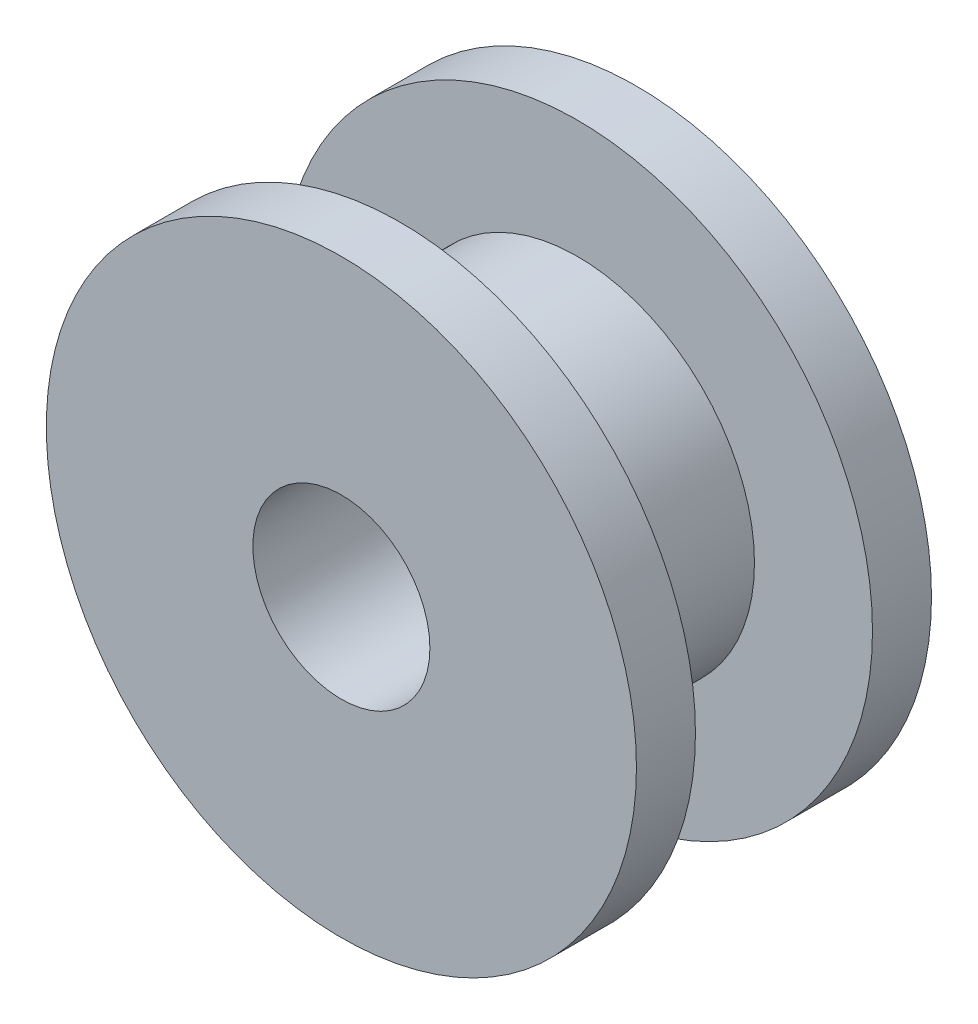
ISO-10303-21;
HEADER;
FILE_DESCRIPTION(('STEP AP214'),'2;1');
FILE_NAME('part.step','',(''),(''),'','','');
FILE_SCHEMA(('AUTOMOTIVE_DESIGN { 1 0 10303 214 1 1 1 1 }'));
ENDSEC;
DATA;
#1=APPLICATION_CONTEXT('core data for automotive mechanical design processes');
#2=APPLICATION_PROTOCOL_DEFINITION('international standard','automotive_design',2000,#1);
#3=PRODUCT_CONTEXT('',#1,'mechanical');
#4=PRODUCT('Part','Part','',(#3));
#5=PRODUCT_RELATED_PRODUCT_CATEGORY('part','',(#4));
#6=PRODUCT_DEFINITION_FORMATION('','',#4);
#7=PRODUCT_DEFINITION_CONTEXT('part definition',#1,'design');
#8=PRODUCT_DEFINITION('design','',#6,#7);
#9=PRODUCT_DEFINITION_SHAPE('','',#8);
#10=(LENGTH_UNIT() NAMED_UNIT(*) SI_UNIT(.MILLI.,.METRE.));
#11=(NAMED_UNIT(*) PLANE_ANGLE_UNIT() SI_UNIT($,.RADIAN.));
#12=(NAMED_UNIT(*) SI_UNIT($,.STERADIAN.) SOLID_ANGLE_UNIT());
#13=UNCERTAINTY_MEASURE_WITH_UNIT(LENGTH_MEASURE(1.E-05),#10,'distance_accuracy_value','');
#14=(GEOMETRIC_REPRESENTATION_CONTEXT(3) GLOBAL_UNCERTAINTY_ASSIGNED_CONTEXT((#13)) GLOBAL_UNIT_ASSIGNED_CONTEXT((#10,
#11,#12)) REPRESENTATION_CONTEXT('',''));
#15=CARTESIAN_POINT('',(0.,0.,0.));
#16=DIRECTION('',(0.,0.,1.));
#17=DIRECTION('',(1.,0.,0.));
#18=AXIS2_PLACEMENT_3D('',#15,#16,#17);
#19=CARTESIAN_POINT('',(0.,0.,0.75));
#20=DIRECTION('',(0.,0.,-1.));
#21=DIRECTION('',(-1.,0.,0.));
#22=AXIS2_PLACEMENT_3D('',#19,#20,#21);
#23=CYLINDRICAL_SURFACE('',#22,1.5);
#24=CARTESIAN_POINT('',(0.,0.,0.75));
#25=DIRECTION('',(0.,0.,1.));
#26=DIRECTION('',(1.,0.,0.));
#27=AXIS2_PLACEMENT_3D('',#24,#25,#26);
#28=CIRCLE('',#27,1.5);
#29=CARTESIAN_POINT('',(1.5,0.,0.75));
#30=VERTEX_POINT('',#29);
#31=EDGE_CURVE('E10',#30,#30,#28,.T.);
#32=ORIENTED_EDGE('',*,*,#31,.F.);
#33=EDGE_LOOP('',(#32));
#34=FACE_BOUND('',#33,.T.);
#35=CARTESIAN_POINT('',(0.,0.,-0.75));
#36=DIRECTION('',(0.,0.,1.));
#37=DIRECTION('',(1.,0.,0.));
#38=AXIS2_PLACEMENT_3D('',#35,#36,#37);
#39=CIRCLE('',#38,1.5);
#40=CARTESIAN_POINT('',(1.5,0.,-0.75));
#41=VERTEX_POINT('',#40);
#42=EDGE_CURVE('E42',#41,#41,#39,.T.);
#43=ORIENTED_EDGE('',*,*,#42,.T.);
#44=EDGE_LOOP('',(#43));
#45=FACE_BOUND('',#44,.T.);
#46=ADVANCED_FACE('F39',(#34,#45),#23,.T.);
#47=CARTESIAN_POINT('',(0.,0.,1.25));
#48=DIRECTION('',(0.,0.,-1.));
#49=DIRECTION('',(-1.,0.,0.));
#50=AXIS2_PLACEMENT_3D('',#47,#48,#49);
#51=CYLINDRICAL_SURFACE('',#50,2.5);
#52=CARTESIAN_POINT('',(0.,0.,1.25));
#53=DIRECTION('',(0.,0.,1.));
#54=DIRECTION('',(1.,0.,0.));
#55=AXIS2_PLACEMENT_3D('',#52,#53,#54);
#56=CIRCLE('',#55,2.5);
#57=CARTESIAN_POINT('',(2.5,0.,1.25));
#58=VERTEX_POINT('',#57);
#59=EDGE_CURVE('E46',#58,#58,#56,.T.);
#60=ORIENTED_EDGE('',*,*,#59,.F.);
#61=EDGE_LOOP('',(#60));
#62=FACE_BOUND('',#61,.T.);
#63=CARTESIAN_POINT('',(0.,0.,0.75));
#64=DIRECTION('',(0.,0.,1.));
#65=DIRECTION('',(1.,0.,0.));
#66=AXIS2_PLACEMENT_3D('',#63,#64,#65);
#67=CIRCLE('',#66,2.5);
#68=CARTESIAN_POINT('',(2.5,0.,0.75));
#69=VERTEX_POINT('',#68);
#70=EDGE_CURVE('E50',#69,#69,#67,.T.);
#71=ORIENTED_EDGE('',*,*,#70,.T.);
#72=EDGE_LOOP('',(#71));
#73=FACE_BOUND('',#72,.T.);
#74=ADVANCED_FACE('F82',(#62,#73),#51,.T.);
#75=CARTESIAN_POINT('',(0.,0.,1.25));
#76=DIRECTION('',(0.,0.,1.));
#77=DIRECTION('',(1.,0.,0.));
#78=AXIS2_PLACEMENT_3D('',#75,#76,#77);
#79=PLANE('',#78);
#80=CARTESIAN_POINT('',(0.,0.,1.25));
#81=DIRECTION('',(0.,0.,1.));
#82=DIRECTION('',(1.,0.,0.));
#83=AXIS2_PLACEMENT_3D('',#80,#81,#82);
#84=CIRCLE('',#83,0.75);
#85=CARTESIAN_POINT('',(0.75,0.,1.25));
#86=VERTEX_POINT('',#85);
#87=EDGE_CURVE('E62',#86,#86,#84,.T.);
#88=ORIENTED_EDGE('',*,*,#87,.F.);
#89=EDGE_LOOP('',(#88));
#90=FACE_BOUND('',#89,.T.);
#91=ORIENTED_EDGE('',*,*,#59,.T.);
#92=EDGE_LOOP('',(#91));
#93=FACE_BOUND('',#92,.T.);
#94=ADVANCED_FACE('F78',(#90,#93),#79,.T.);
#95=CARTESIAN_POINT('',(0.,0.,0.75));
#96=DIRECTION('',(0.,0.,1.));
#97=DIRECTION('',(1.,0.,0.));
#98=AXIS2_PLACEMENT_3D('',#95,#96,#97);
#99=PLANE('',#98);
#100=ORIENTED_EDGE('',*,*,#31,.T.);
#101=EDGE_LOOP('',(#100));
#102=FACE_BOUND('',#101,.T.);
#103=ORIENTED_EDGE('',*,*,#70,.F.);
#104=EDGE_LOOP('',(#103));
#105=FACE_BOUND('',#104,.T.);
#106=ADVANCED_FACE('F81',(#102,#105),#99,.F.);
#107=CARTESIAN_POINT('',(0.,0.,-1.25));
#108=DIRECTION('',(0.,0.,1.));
#109=DIRECTION('',(1.,0.,0.));
#110=AXIS2_PLACEMENT_3D('',#107,#108,#109);
#111=CYLINDRICAL_SURFACE('',#110,2.5);
#112=CARTESIAN_POINT('',(0.,0.,-1.25));
#113=DIRECTION('',(0.,0.,1.));
#114=DIRECTION('',(1.,0.,0.));
#115=AXIS2_PLACEMENT_3D('',#112,#113,#114);
#116=CIRCLE('',#115,2.5);
#117=CARTESIAN_POINT('',(2.5,0.,-1.25));
#118=VERTEX_POINT('',#117);
#119=EDGE_CURVE('E58',#118,#118,#116,.T.);
#120=ORIENTED_EDGE('',*,*,#119,.T.);
#121=EDGE_LOOP('',(#120));
#122=FACE_BOUND('',#121,.T.);
#123=CARTESIAN_POINT('',(0.,0.,-0.75));
#124=DIRECTION('',(0.,0.,1.));
#125=DIRECTION('',(1.,0.,0.));
#126=AXIS2_PLACEMENT_3D('',#123,#124,#125);
#127=CIRCLE('',#126,2.5);
#128=CARTESIAN_POINT('',(2.5,0.,-0.75));
#129=VERTEX_POINT('',#128);
#130=EDGE_CURVE('E55',#129,#129,#127,.T.);
#131=ORIENTED_EDGE('',*,*,#130,.F.);
#132=EDGE_LOOP('',(#131));
#133=FACE_BOUND('',#132,.T.);
#134=ADVANCED_FACE('F91',(#122,#133),#111,.T.);
#135=CARTESIAN_POINT('',(0.,0.,-1.25));
#136=DIRECTION('',(0.,0.,-1.));
#137=DIRECTION('',(1.,0.,0.));
#138=AXIS2_PLACEMENT_3D('',#135,#136,#137);
#139=PLANE('',#138);
#140=CARTESIAN_POINT('',(0.,0.,-1.25));
#141=DIRECTION('',(0.,0.,1.));
#142=DIRECTION('',(1.,0.,0.));
#143=AXIS2_PLACEMENT_3D('',#140,#141,#142);
#144=CIRCLE('',#143,0.75);
#145=CARTESIAN_POINT('',(0.75,0.,-1.25));
#146=VERTEX_POINT('',#145);
#147=EDGE_CURVE('E59',#146,#146,#144,.T.);
#148=ORIENTED_EDGE('',*,*,#147,.T.);
#149=EDGE_LOOP('',(#148));
#150=FACE_BOUND('',#149,.T.);
#151=ORIENTED_EDGE('',*,*,#119,.F.);
#152=EDGE_LOOP('',(#151));
#153=FACE_BOUND('',#152,.T.);
#154=ADVANCED_FACE('F68',(#150,#153),#139,.T.);
#155=CARTESIAN_POINT('',(0.,0.,-0.75));
#156=DIRECTION('',(0.,0.,-1.));
#157=DIRECTION('',(1.,0.,0.));
#158=AXIS2_PLACEMENT_3D('',#155,#156,#157);
#159=PLANE('',#158);
#160=ORIENTED_EDGE('',*,*,#42,.F.);
#161=EDGE_LOOP('',(#160));
#162=FACE_BOUND('',#161,.T.);
#163=ORIENTED_EDGE('',*,*,#130,.T.);
#164=EDGE_LOOP('',(#163));
#165=FACE_BOUND('',#164,.T.);
#166=ADVANCED_FACE('F74',(#162,#165),#159,.F.);
#167=CARTESIAN_POINT('',(0.,0.,-1.25));
#168=DIRECTION('',(0.,0.,1.));
#169=DIRECTION('',(1.,0.,0.));
#170=AXIS2_PLACEMENT_3D('',#167,#168,#169);
#171=CYLINDRICAL_SURFACE('',#170,0.75);
#172=ORIENTED_EDGE('',*,*,#147,.F.);
#173=EDGE_LOOP('',(#172));
#174=FACE_BOUND('',#173,.T.);
#175=ORIENTED_EDGE('',*,*,#87,.T.);
#176=EDGE_LOOP('',(#175));
#177=FACE_BOUND('',#176,.T.);
#178=ADVANCED_FACE('F71',(#174,#177),#171,.F.);
#179=CLOSED_SHELL('',(#46,#74,#94,#106,#134,#154,#166,#178));
#180=MANIFOLD_SOLID_BREP('B2',#179);
#181=ADVANCED_BREP_SHAPE_REPRESENTATION('',(#18,#180),#14);
#182=SHAPE_DEFINITION_REPRESENTATION(#9,#181);
ENDSEC;
END-ISO-10303-21;
